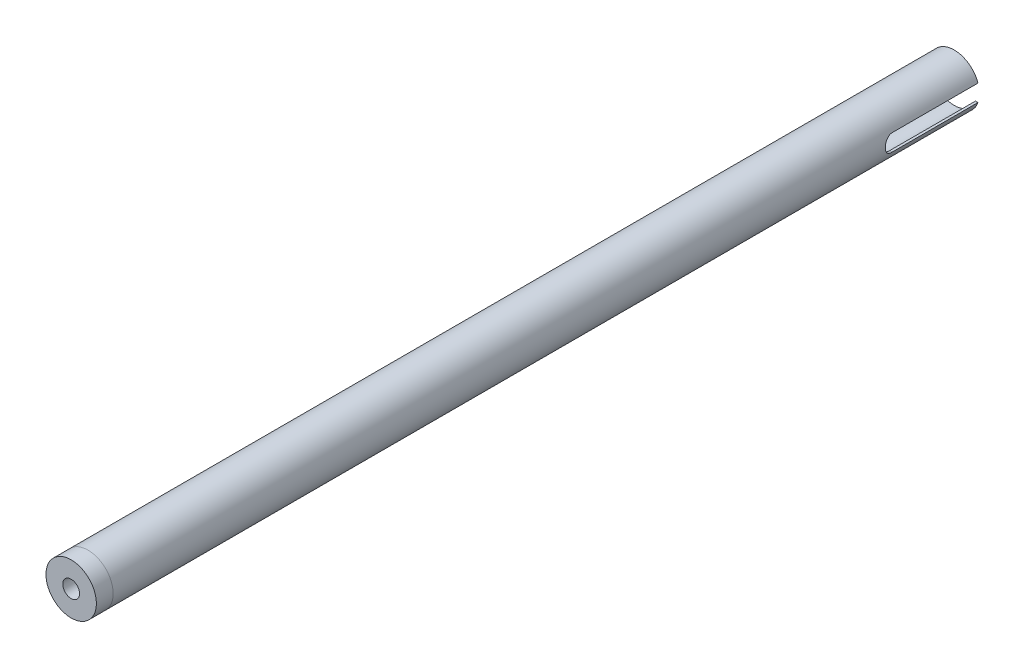
ISO-10303-21;
HEADER;
FILE_DESCRIPTION(('STEP AP214'),'2;1');
FILE_NAME('part.step','',(''),(''),'','','');
FILE_SCHEMA(('AUTOMOTIVE_DESIGN { 1 0 10303 214 1 1 1 1 }'));
ENDSEC;
DATA;
#1=APPLICATION_CONTEXT('core data for automotive mechanical design processes');
#2=APPLICATION_PROTOCOL_DEFINITION('international standard','automotive_design',2000,#1);
#3=PRODUCT_CONTEXT('',#1,'mechanical');
#4=PRODUCT('Part','Part','',(#3));
#5=PRODUCT_RELATED_PRODUCT_CATEGORY('part','',(#4));
#6=PRODUCT_DEFINITION_FORMATION('','',#4);
#7=PRODUCT_DEFINITION_CONTEXT('part definition',#1,'design');
#8=PRODUCT_DEFINITION('design','',#6,#7);
#9=PRODUCT_DEFINITION_SHAPE('','',#8);
#10=(LENGTH_UNIT() NAMED_UNIT(*) SI_UNIT(.MILLI.,.METRE.));
#11=(NAMED_UNIT(*) PLANE_ANGLE_UNIT() SI_UNIT($,.RADIAN.));
#12=(NAMED_UNIT(*) SI_UNIT($,.STERADIAN.) SOLID_ANGLE_UNIT());
#13=UNCERTAINTY_MEASURE_WITH_UNIT(LENGTH_MEASURE(1.E-05),#10,'distance_accuracy_value','');
#14=(GEOMETRIC_REPRESENTATION_CONTEXT(3) GLOBAL_UNCERTAINTY_ASSIGNED_CONTEXT((#13)) GLOBAL_UNIT_ASSIGNED_CONTEXT((#10,
#11,#12)) REPRESENTATION_CONTEXT('',''));
#15=CARTESIAN_POINT('',(0.,0.,0.));
#16=DIRECTION('',(0.,0.,1.));
#17=DIRECTION('',(1.,0.,0.));
#18=AXIS2_PLACEMENT_3D('',#15,#16,#17);
#19=CARTESIAN_POINT('',(0.,0.,-333.573444203244));
#20=DIRECTION('',(0.,0.,1.));
#21=DIRECTION('',(1.,0.,0.));
#22=AXIS2_PLACEMENT_3D('',#19,#20,#21);
#23=CYLINDRICAL_SURFACE('',#22,9.525);
#24=CARTESIAN_POINT('',(0.,0.,-6.35));
#25=DIRECTION('',(0.,0.,1.));
#26=DIRECTION('',(1.,0.,0.));
#27=AXIS2_PLACEMENT_3D('',#24,#25,#26);
#28=CIRCLE('',#27,9.525);
#29=CARTESIAN_POINT('',(9.525,0.,-6.35));
#30=VERTEX_POINT('',#29);
#31=EDGE_CURVE('E167',#30,#30,#28,.T.);
#32=ORIENTED_EDGE('',*,*,#31,.F.);
#33=EDGE_LOOP('',(#32));
#34=FACE_BOUND('',#33,.T.);
#35=CARTESIAN_POINT('',(-8.98025612106915,3.175,-301.188444203244));
#36=CARTESIAN_POINT('',(-8.98024230233901,3.17501142134308,-301.101818099908));
#37=CARTESIAN_POINT('',(-8.98150922759707,3.17145501317748,-301.015199717432));
#38=CARTESIAN_POINT('',(-8.98650170400112,3.1572955094353,-300.842634902606));
#39=CARTESIAN_POINT('',(-8.99022659113085,3.14669431699564,-300.75668829512));
#40=CARTESIAN_POINT('',(-9.00001740508998,3.11857670914845,-300.586334053955));
#41=CARTESIAN_POINT('',(-9.00607621805003,3.10108130380328,-300.501922552148));
#42=CARTESIAN_POINT('',(-9.02033586435303,3.05935434973544,-300.334987750813));
#43=CARTESIAN_POINT('',(-9.02853677497232,3.03512255799513,-300.252464519521));
#44=CARTESIAN_POINT('',(-9.05598792154067,2.95264369348964,-300.008665896245));
#45=CARTESIAN_POINT('',(-9.07810200713862,2.88457148458964,-299.85091231192));
#46=CARTESIAN_POINT('',(-9.127451360236,2.72437908867648,-299.549035793431));
#47=CARTESIAN_POINT('',(-9.15468995097455,2.63224328129309,-299.404921796203));
#48=CARTESIAN_POINT('',(-9.21240416673121,2.42269155952415,-299.128768936378));
#49=CARTESIAN_POINT('',(-9.24296008478943,2.30449853156514,-298.997335354516));
#50=CARTESIAN_POINT('',(-9.30318902123142,2.04784031127147,-298.75574005818));
#51=CARTESIAN_POINT('',(-9.33286185998227,1.90937102786997,-298.645582646947));
#52=CARTESIAN_POINT('',(-9.38892492365177,1.61159672697581,-298.446865635459));
#53=CARTESIAN_POINT('',(-9.41520772598946,1.45183792838573,-298.358953449449));
#54=CARTESIAN_POINT('',(-9.46054712430068,1.11883883316166,-298.211548723379));
#55=CARTESIAN_POINT('',(-9.47961052807859,0.945611424033788,-298.152029395378));
#56=CARTESIAN_POINT('',(-9.50410661247238,0.642992499572375,-298.076550630882));
#57=CARTESIAN_POINT('',(-9.51189798251809,0.515662964136016,-298.052932658839));
#58=CARTESIAN_POINT('',(-9.51973491912187,0.323120458247701,-298.029266392665));
#59=CARTESIAN_POINT('',(-9.52170555244691,0.258670486244991,-298.023337745049));
#60=CARTESIAN_POINT('',(-9.52433958502699,0.12948493034666,-298.015425120382));
#61=CARTESIAN_POINT('',(-9.5250026318504,0.0647492741617728,-298.013442206818));
#62=CARTESIAN_POINT('',(-9.525,0.,-298.013444203244));
#63=B_SPLINE_CURVE_WITH_KNOTS('',3,(#35,#36,#37,#38,#39,#40,#41,#42,#43,#44,#45,#46,#47,#48,#49,
#50,#51,#52,#53,#54,#55,#56,#57,#58,#59,#60,#61,#62),.UNSPECIFIED.,.F.,.F.,(4,2,2,2,2,2,2,2,2,2,
2,2,2,4),(0.,0.259783027985017,0.519495904525443,0.77842335407941,1.0373601457496,
1.55448370709133,2.07194378605916,2.60765740005743,3.14347925237348,3.69345572792671,
4.24291228331228,4.63105001394513,4.82518498412947,5.01937227204625),.UNSPECIFIED.);
#64=CARTESIAN_POINT('',(-8.98025612106915,3.175,-301.188444203244));
#65=VERTEX_POINT('',#64);
#66=CARTESIAN_POINT('',(-9.525,0.,-298.013444203244));
#67=VERTEX_POINT('',#66);
#68=EDGE_CURVE('E194',#65,#67,#63,.T.);
#69=ORIENTED_EDGE('',*,*,#68,.T.);
#70=CARTESIAN_POINT('',(-9.525,0.,-298.013444203244));
#71=CARTESIAN_POINT('',(-9.52501110102584,-0.0867614879611047,-298.013433098206));
#72=CARTESIAN_POINT('',(-9.52381482114642,-0.173516026970688,-298.017000309863));
#73=CARTESIAN_POINT('',(-9.51909010104991,-0.346361025979108,-298.031205148445));
#74=CARTESIAN_POINT('',(-9.51556219632442,-0.432451633867625,-298.041841151922));
#75=CARTESIAN_POINT('',(-9.50626969526085,-0.603121388983429,-298.070058143436));
#76=CARTESIAN_POINT('',(-9.50051134567603,-0.687704073408636,-298.087619737605));
#77=CARTESIAN_POINT('',(-9.48692170416637,-0.854983898510564,-298.129511058243));
#78=CARTESIAN_POINT('',(-9.47909035815865,-0.937680989932468,-298.153840961292));
#79=CARTESIAN_POINT('',(-9.45278540829331,-1.18202731628102,-298.236675354231));
#80=CARTESIAN_POINT('',(-9.43148823554423,-1.3401498669332,-298.305061035576));
#81=CARTESIAN_POINT('',(-9.38354405256208,-1.64264414222568,-298.465987561352));
#82=CARTESIAN_POINT('',(-9.35689419571071,-1.78700848960572,-298.558541266506));
#83=CARTESIAN_POINT('',(-9.30002401422067,-2.06291632995428,-298.768534694711));
#84=CARTESIAN_POINT('',(-9.26971861159363,-2.19392359690275,-298.88665698013));
#85=CARTESIAN_POINT('',(-9.20941732427212,-2.43468689521899,-299.142994956965));
#86=CARTESIAN_POINT('',(-9.1794215361322,-2.54443647619593,-299.281216725124));
#87=CARTESIAN_POINT('',(-9.122187697517,-2.74268087840455,-299.578724704171));
#88=CARTESIAN_POINT('',(-9.09505529775998,-2.83046425019681,-299.738506842244));
#89=CARTESIAN_POINT('',(-9.04794936227173,-2.9776233718293,-300.071551164249));
#90=CARTESIAN_POINT('',(-9.0279682579705,-3.03702917747985,-300.244798859057));
#91=CARTESIAN_POINT('',(-9.00226999890487,-3.1122125650425,-300.547085893052));
#92=CARTESIAN_POINT('',(-8.99408207355733,-3.13569679171672,-300.674048214479));
#93=CARTESIAN_POINT('',(-8.98304472933549,-3.16711304593222,-300.930125386248));
#94=CARTESIAN_POINT('',(-8.98019613476149,-3.17504267212105,-301.05924056585));
#95=CARTESIAN_POINT('',(-8.98025612106915,-3.175,-301.188444203244));
#96=B_SPLINE_CURVE_WITH_KNOTS('',3,(#70,#71,#72,#73,#74,#75,#76,#77,#78,#79,#80,#81,#82,#83,#84,
#85,#86,#87,#88,#89,#90,#91,#92,#93,#94,#95),.UNSPECIFIED.,.F.,.F.,(4,2,2,2,2,2,2,2,2,2,2,2,4),
(0.,0.260191091827307,0.52032244773723,0.779730467212497,1.03914525511038,1.55731822615721,
2.07576750062865,2.61028978360824,3.14497400776474,3.6952175213376,4.24487695078963,
4.63199348452988,5.01916977744542),.UNSPECIFIED.);
#97=CARTESIAN_POINT('',(-8.98025612106916,-3.175,-301.188444203244));
#98=VERTEX_POINT('',#97);
#99=EDGE_CURVE('E146',#67,#98,#96,.T.);
#100=ORIENTED_EDGE('',*,*,#99,.T.);
#101=DIRECTION('',(0.,0.,-1.));
#102=VECTOR('',#101,1.);
#103=CARTESIAN_POINT('',(-8.98025612106916,-3.175,-298.013444203244));
#104=LINE('',#103,#102);
#105=CARTESIAN_POINT('',(-8.98025612106916,-3.175,-333.573444203244));
#106=VERTEX_POINT('',#105);
#107=EDGE_CURVE('E141',#98,#106,#104,.T.);
#108=ORIENTED_EDGE('',*,*,#107,.T.);
#109=CARTESIAN_POINT('',(0.,0.,-333.573444203244));
#110=DIRECTION('',(0.,0.,1.));
#111=DIRECTION('',(1.,0.,0.));
#112=AXIS2_PLACEMENT_3D('',#109,#110,#111);
#113=CIRCLE('',#112,9.525);
#114=CARTESIAN_POINT('',(8.98025612106915,-3.175,-333.573444203244));
#115=VERTEX_POINT('',#114);
#116=EDGE_CURVE('E144',#106,#115,#113,.T.);
#117=ORIENTED_EDGE('',*,*,#116,.T.);
#118=DIRECTION('',(0.,0.,-1.));
#119=VECTOR('',#118,1.);
#120=CARTESIAN_POINT('',(8.98025612106915,-3.175,-298.013444203244));
#121=LINE('',#120,#119);
#122=CARTESIAN_POINT('',(8.98025612106915,-3.175,-301.188444203244));
#123=VERTEX_POINT('',#122);
#124=EDGE_CURVE('E427',#123,#115,#121,.T.);
#125=ORIENTED_EDGE('',*,*,#124,.F.);
#126=CARTESIAN_POINT('',(8.98025612106915,-3.175,-301.188444203244));
#127=CARTESIAN_POINT('',(8.98024230233901,-3.17501142134308,-301.101818099908));
#128=CARTESIAN_POINT('',(8.98150922759707,-3.17145501317748,-301.015199717432));
#129=CARTESIAN_POINT('',(8.98650170400112,-3.1572955094353,-300.842634902606));
#130=CARTESIAN_POINT('',(8.99022659113085,-3.14669431699564,-300.75668829512));
#131=CARTESIAN_POINT('',(9.00001740508998,-3.11857670914845,-300.586334053955));
#132=CARTESIAN_POINT('',(9.00607621805003,-3.10108130380328,-300.501922552148));
#133=CARTESIAN_POINT('',(9.02033586435303,-3.05935434973544,-300.334987750813));
#134=CARTESIAN_POINT('',(9.02853677497232,-3.03512255799513,-300.252464519521));
#135=CARTESIAN_POINT('',(9.05598792154067,-2.95264369348964,-300.008665896245));
#136=CARTESIAN_POINT('',(9.07810200713862,-2.88457148458964,-299.85091231192));
#137=CARTESIAN_POINT('',(9.127451360236,-2.72437908867648,-299.549035793431));
#138=CARTESIAN_POINT('',(9.15468995097455,-2.63224328129309,-299.404921796203));
#139=CARTESIAN_POINT('',(9.21240416673121,-2.42269155952415,-299.128768936378));
#140=CARTESIAN_POINT('',(9.24296008478943,-2.30449853156514,-298.997335354516));
#141=CARTESIAN_POINT('',(9.30318902123142,-2.04784031127147,-298.75574005818));
#142=CARTESIAN_POINT('',(9.33286185998227,-1.90937102786997,-298.645582646947));
#143=CARTESIAN_POINT('',(9.38892492365177,-1.61159672697581,-298.446865635459));
#144=CARTESIAN_POINT('',(9.41520772598946,-1.45183792838573,-298.358953449449));
#145=CARTESIAN_POINT('',(9.46054712430068,-1.11883883316166,-298.211548723379));
#146=CARTESIAN_POINT('',(9.47961052807859,-0.945611424033788,-298.152029395378));
#147=CARTESIAN_POINT('',(9.50410661247238,-0.642992499572375,-298.076550630882));
#148=CARTESIAN_POINT('',(9.51189798251809,-0.515662964136016,-298.052932658839));
#149=CARTESIAN_POINT('',(9.51973491912187,-0.323120458247701,-298.029266392665));
#150=CARTESIAN_POINT('',(9.52170555244691,-0.258670486244991,-298.023337745049));
#151=CARTESIAN_POINT('',(9.52433958502699,-0.12948493034666,-298.015425120382));
#152=CARTESIAN_POINT('',(9.5250026318504,-0.0647492741617728,-298.013442206818));
#153=CARTESIAN_POINT('',(9.525,0.,-298.013444203244));
#154=B_SPLINE_CURVE_WITH_KNOTS('',3,(#126,#127,#128,#129,#130,#131,#132,#133,#134,#135,#136,
#137,#138,#139,#140,#141,#142,#143,#144,#145,#146,#147,#148,#149,#150,#151,#152,#153),
.UNSPECIFIED.,.F.,.F.,(4,2,2,2,2,2,2,2,2,2,2,2,2,4),(0.,0.259783027985017,0.519495904525443,
0.77842335407941,1.0373601457496,1.55448370709133,2.07194378605916,2.60765740005743,
3.14347925237348,3.69345572792671,4.24291228331228,4.63105001394513,4.82518498412947,
5.01937227204625),.UNSPECIFIED.);
#155=CARTESIAN_POINT('',(9.525,0.,-298.013444203244));
#156=VERTEX_POINT('',#155);
#157=EDGE_CURVE('E87',#123,#156,#154,.T.);
#158=ORIENTED_EDGE('',*,*,#157,.T.);
#159=CARTESIAN_POINT('',(9.525,0.,-298.013444203244));
#160=CARTESIAN_POINT('',(9.52501110102584,0.0867614879611047,-298.013433098206));
#161=CARTESIAN_POINT('',(9.52381482114642,0.173516026970688,-298.017000309863));
#162=CARTESIAN_POINT('',(9.51909010104991,0.346361025979108,-298.031205148445));
#163=CARTESIAN_POINT('',(9.51556219632442,0.432451633867625,-298.041841151922));
#164=CARTESIAN_POINT('',(9.50626969526085,0.603121388983429,-298.070058143436));
#165=CARTESIAN_POINT('',(9.50051134567603,0.687704073408636,-298.087619737605));
#166=CARTESIAN_POINT('',(9.48692170416637,0.854983898510564,-298.129511058243));
#167=CARTESIAN_POINT('',(9.47909035815865,0.937680989932468,-298.153840961292));
#168=CARTESIAN_POINT('',(9.45278540829331,1.18202731628102,-298.236675354231));
#169=CARTESIAN_POINT('',(9.43148823554423,1.3401498669332,-298.305061035576));
#170=CARTESIAN_POINT('',(9.38354405256208,1.64264414222568,-298.465987561352));
#171=CARTESIAN_POINT('',(9.35689419571071,1.78700848960572,-298.558541266506));
#172=CARTESIAN_POINT('',(9.30002401422067,2.06291632995428,-298.768534694711));
#173=CARTESIAN_POINT('',(9.26971861159363,2.19392359690275,-298.88665698013));
#174=CARTESIAN_POINT('',(9.20941732427212,2.43468689521899,-299.142994956965));
#175=CARTESIAN_POINT('',(9.1794215361322,2.54443647619593,-299.281216725124));
#176=CARTESIAN_POINT('',(9.122187697517,2.74268087840455,-299.578724704171));
#177=CARTESIAN_POINT('',(9.09505529775998,2.83046425019681,-299.738506842244));
#178=CARTESIAN_POINT('',(9.04794936227173,2.9776233718293,-300.071551164249));
#179=CARTESIAN_POINT('',(9.0279682579705,3.03702917747985,-300.244798859057));
#180=CARTESIAN_POINT('',(9.00226999890487,3.1122125650425,-300.547085893052));
#181=CARTESIAN_POINT('',(8.99408207355733,3.13569679171672,-300.674048214479));
#182=CARTESIAN_POINT('',(8.98304472933549,3.16711304593222,-300.930125386248));
#183=CARTESIAN_POINT('',(8.98019613476149,3.17504267212105,-301.05924056585));
#184=CARTESIAN_POINT('',(8.98025612106915,3.175,-301.188444203244));
#185=B_SPLINE_CURVE_WITH_KNOTS('',3,(#159,#160,#161,#162,#163,#164,#165,#166,#167,#168,#169,
#170,#171,#172,#173,#174,#175,#176,#177,#178,#179,#180,#181,#182,#183,#184),.UNSPECIFIED.,.F.,
.F.,(4,2,2,2,2,2,2,2,2,2,2,2,4),(0.,0.260191091827307,0.52032244773723,0.779730467212497,
1.03914525511038,1.55731822615721,2.07576750062865,2.61028978360824,3.14497400776474,
3.6952175213376,4.24487695078963,4.63199348452988,5.01916977744542),.UNSPECIFIED.);
#186=CARTESIAN_POINT('',(8.98025612106915,3.175,-301.188444203244));
#187=VERTEX_POINT('',#186);
#188=EDGE_CURVE('E73',#156,#187,#185,.T.);
#189=ORIENTED_EDGE('',*,*,#188,.T.);
#190=DIRECTION('',(0.,0.,-1.));
#191=VECTOR('',#190,1.);
#192=CARTESIAN_POINT('',(8.98025612106915,3.175,-298.013444203244));
#193=LINE('',#192,#191);
#194=CARTESIAN_POINT('',(8.98025612106915,3.175,-333.573444203244));
#195=VERTEX_POINT('',#194);
#196=EDGE_CURVE('E160',#187,#195,#193,.T.);
#197=ORIENTED_EDGE('',*,*,#196,.T.);
#198=CARTESIAN_POINT('',(-8.98025612106915,3.175,-333.573444203244));
#199=VERTEX_POINT('',#198);
#200=EDGE_CURVE('E166',#195,#199,#113,.T.);
#201=ORIENTED_EDGE('',*,*,#200,.T.);
#202=DIRECTION('',(0.,0.,-1.));
#203=VECTOR('',#202,1.);
#204=CARTESIAN_POINT('',(-8.98025612106915,3.175,-298.013444203244));
#205=LINE('',#204,#203);
#206=EDGE_CURVE('E420',#65,#199,#205,.T.);
#207=ORIENTED_EDGE('',*,*,#206,.F.);
#208=EDGE_LOOP('',(#69,#100,#108,#117,#125,#158,#189,#197,#201,#207));
#209=FACE_BOUND('',#208,.T.);
#210=ADVANCED_FACE('F63',(#34,#209),#23,.T.);
#211=CARTESIAN_POINT('',(0.,0.,-333.573444203244));
#212=DIRECTION('',(0.,0.,1.));
#213=DIRECTION('',(1.,0.,0.));
#214=AXIS2_PLACEMENT_3D('',#211,#212,#213);
#215=PLANE('',#214);
#216=DIRECTION('',(1.,0.,0.));
#217=VECTOR('',#216,1.);
#218=CARTESIAN_POINT('',(0.,-3.175,-333.573444203244));
#219=LINE('',#218,#217);
#220=CARTESIAN_POINT('',(-8.03118117091129,-3.175,-333.573444203244));
#221=VERTEX_POINT('',#220);
#222=EDGE_CURVE('E153',#106,#221,#219,.T.);
#223=ORIENTED_EDGE('',*,*,#222,.T.);
#224=CARTESIAN_POINT('',(0.,0.,-333.573444203244));
#225=DIRECTION('',(0.,0.,1.));
#226=DIRECTION('',(1.,0.,0.));
#227=AXIS2_PLACEMENT_3D('',#224,#225,#226);
#228=CIRCLE('',#227,8.636);
#229=CARTESIAN_POINT('',(8.03118117091129,-3.175,-333.573444203244));
#230=VERTEX_POINT('',#229);
#231=EDGE_CURVE('E275',#221,#230,#228,.T.);
#232=ORIENTED_EDGE('',*,*,#231,.T.);
#233=DIRECTION('',(1.,0.,0.));
#234=VECTOR('',#233,1.);
#235=CARTESIAN_POINT('',(0.,-3.175,-333.573444203244));
#236=LINE('',#235,#234);
#237=EDGE_CURVE('E165',#230,#115,#236,.T.);
#238=ORIENTED_EDGE('',*,*,#237,.T.);
#239=ORIENTED_EDGE('',*,*,#116,.F.);
#240=EDGE_LOOP('',(#223,#232,#238,#239));
#241=FACE_BOUND('',#240,.T.);
#242=ADVANCED_FACE('F163',(#241),#215,.F.);
#243=CARTESIAN_POINT('',(0.,0.,-333.573444203244));
#244=DIRECTION('',(0.,0.,1.));
#245=DIRECTION('',(1.,0.,0.));
#246=AXIS2_PLACEMENT_3D('',#243,#244,#245);
#247=CYLINDRICAL_SURFACE('',#246,8.636);
#248=CARTESIAN_POINT('',(0.,0.,-6.35));
#249=DIRECTION('',(0.,0.,1.));
#250=DIRECTION('',(1.,0.,0.));
#251=AXIS2_PLACEMENT_3D('',#248,#249,#250);
#252=CIRCLE('',#251,8.636);
#253=CARTESIAN_POINT('',(8.636,0.,-6.35));
#254=VERTEX_POINT('',#253);
#255=EDGE_CURVE('E149',#254,#254,#252,.T.);
#256=ORIENTED_EDGE('',*,*,#255,.T.);
#257=EDGE_LOOP('',(#256));
#258=FACE_BOUND('',#257,.T.);
#259=DIRECTION('',(0.,0.,-1.));
#260=VECTOR('',#259,1.);
#261=CARTESIAN_POINT('',(-8.03118117091129,-3.175,-298.013444203244));
#262=LINE('',#261,#260);
#263=CARTESIAN_POINT('',(-8.03118117091129,-3.175,-301.188444203244));
#264=VERTEX_POINT('',#263);
#265=EDGE_CURVE('E150',#264,#221,#262,.T.);
#266=ORIENTED_EDGE('',*,*,#265,.F.);
#267=CARTESIAN_POINT('',(-8.03118117091129,-3.175,-301.188444203244));
#268=CARTESIAN_POINT('',(-8.03116550357192,-3.17501203663229,-301.102409235128));
#269=CARTESIAN_POINT('',(-8.03256328665432,-3.17150327993899,-301.016382882599));
#270=CARTESIAN_POINT('',(-8.03806891362409,-3.15753809299539,-300.845010312129));
#271=CARTESIAN_POINT('',(-8.04217588089716,-3.14708391007799,-300.759663883223));
#272=CARTESIAN_POINT('',(-8.05296421917626,-3.11937037021479,-300.590554749008));
#273=CARTESIAN_POINT('',(-8.05963650808001,-3.10213501593151,-300.506787538066));
#274=CARTESIAN_POINT('',(-8.07533202922414,-3.06104389654163,-300.341138575298));
#275=CARTESIAN_POINT('',(-8.08435537430867,-3.0371878136549,-300.259256914178));
#276=CARTESIAN_POINT('',(-8.11453837074661,-2.95603278100127,-300.017404756933));
#277=CARTESIAN_POINT('',(-8.13883087950844,-2.88909903597752,-299.860938119358));
#278=CARTESIAN_POINT('',(-8.19300406693486,-2.73167948818753,-299.561403130233));
#279=CARTESIAN_POINT('',(-8.22288931448619,-2.64117440539563,-299.418345877676));
#280=CARTESIAN_POINT('',(-8.28646461334555,-2.43457537576576,-299.142875468438));
#281=CARTESIAN_POINT('',(-8.32026315150129,-2.317546455696,-299.011187096351));
#282=CARTESIAN_POINT('',(-8.38695072719909,-2.06320558041454,-298.768798917958));
#283=CARTESIAN_POINT('',(-8.41983956911545,-1.9258893021522,-298.658103596588));
#284=CARTESIAN_POINT('',(-8.48230406273647,-1.62932475427477,-298.457322481637));
#285=CARTESIAN_POINT('',(-8.5117351959247,-1.46950375402868,-298.368034128132));
#286=CARTESIAN_POINT('',(-8.56262575627031,-1.13591027783605,-298.217971975168));
#287=CARTESIAN_POINT('',(-8.58409342507971,-0.962152453429211,-298.157168678348));
#288=CARTESIAN_POINT('',(-8.61197450421744,-0.656412542712579,-298.079244312699));
#289=CARTESIAN_POINT('',(-8.62092967235125,-0.526538210349253,-298.05462852836));
#290=CARTESIAN_POINT('',(-8.62994176115801,-0.33002097693851,-298.029951196644));
#291=CARTESIAN_POINT('',(-8.63220903333296,-0.264206342476355,-298.023766457494));
#292=CARTESIAN_POINT('',(-8.63523992352765,-0.132266265743979,-298.015511242048));
#293=CARTESIAN_POINT('',(-8.6360031097792,-0.0661407396870706,-298.013441947146));
#294=CARTESIAN_POINT('',(-8.636,0.,-298.013444203244));
#295=B_SPLINE_CURVE_WITH_KNOTS('',3,(#267,#268,#269,#270,#271,#272,#273,#274,#275,#276,#277,
#278,#279,#280,#281,#282,#283,#284,#285,#286,#287,#288,#289,#290,#291,#292,#293,#294),
.UNSPECIFIED.,.F.,.F.,(4,2,2,2,2,2,2,2,2,2,2,2,2,4),(0.,0.258007583993629,0.515931725057005,
0.772951013405637,1.02998264023838,1.54317615093285,2.05679075055082,2.59254838663378,
3.128420352877,3.6819142239817,4.23483365719865,4.63113823379683,4.82943692106888,
5.02779252437178),.UNSPECIFIED.);
#296=CARTESIAN_POINT('',(-8.636,0.,-298.013444203244));
#297=VERTEX_POINT('',#296);
#298=EDGE_CURVE('E221',#264,#297,#295,.T.);
#299=ORIENTED_EDGE('',*,*,#298,.T.);
#300=CARTESIAN_POINT('',(-8.636,0.,-298.013444203244));
#301=CARTESIAN_POINT('',(-8.63601200177566,0.0862340545028663,-298.01343262952));
#302=CARTESIAN_POINT('',(-8.63470866649585,0.172460638964016,-298.01695716954));
#303=CARTESIAN_POINT('',(-8.62956076290727,0.344245368623961,-298.03098859917));
#304=CARTESIAN_POINT('',(-8.62571686385256,0.429803683858972,-298.041493649926));
#305=CARTESIAN_POINT('',(-8.61559314175803,0.599377201936824,-298.069352403981));
#306=CARTESIAN_POINT('',(-8.60932102288695,0.683396413719317,-298.086684449838));
#307=CARTESIAN_POINT('',(-8.5945171663722,0.849553539449469,-298.128015673113));
#308=CARTESIAN_POINT('',(-8.58598535382315,0.93169139093483,-298.152015071546));
#309=CARTESIAN_POINT('',(-8.55732464851214,1.17435074221828,-298.233689252984));
#310=CARTESIAN_POINT('',(-8.53411500636261,1.33136171263578,-298.30108057395));
#311=CARTESIAN_POINT('',(-8.48180653117632,1.63181198358795,-298.45957228396));
#312=CARTESIAN_POINT('',(-8.45270389942466,1.77524244193608,-298.550687976997));
#313=CARTESIAN_POINT('',(-8.39029834803106,2.05036661398533,-298.757941094676));
#314=CARTESIAN_POINT('',(-8.35688032192871,2.18143474113563,-298.874875462268));
#315=CARTESIAN_POINT('',(-8.29018507770489,2.42260670191498,-299.128764448724));
#316=CARTESIAN_POINT('',(-8.25690791509208,2.5327029092675,-299.265726318554));
#317=CARTESIAN_POINT('',(-8.19291826363247,2.73277128594141,-299.561891407379));
#318=CARTESIAN_POINT('',(-8.16234475412034,2.82185641770732,-299.721726496816));
#319=CARTESIAN_POINT('',(-8.10906121054024,2.97153048258984,-300.055321840318));
#320=CARTESIAN_POINT('',(-8.08634169503735,3.03215380703845,-300.229064989987));
#321=CARTESIAN_POINT('',(-8.05677760160867,3.10966172606007,-300.5343336248));
#322=CARTESIAN_POINT('',(-8.04725077861386,3.13409804308655,-300.663714344006));
#323=CARTESIAN_POINT('',(-8.03764862425496,3.15860280233702,-300.859521469847));
#324=CARTESIAN_POINT('',(-8.0352292163598,3.16474613160121,-300.925114226152));
#325=CARTESIAN_POINT('',(-8.03199317651195,3.17294655384153,-301.056614178542));
#326=CARTESIAN_POINT('',(-8.03117703985816,3.17500238406813,-301.122521465493));
#327=CARTESIAN_POINT('',(-8.03118117091129,3.175,-301.188444203244));
#328=B_SPLINE_CURVE_WITH_KNOTS('',3,(#300,#301,#302,#303,#304,#305,#306,#307,#308,#309,#310,
#311,#312,#313,#314,#315,#316,#317,#318,#319,#320,#321,#322,#323,#324,#325,#326,#327),
.UNSPECIFIED.,.F.,.F.,(4,2,2,2,2,2,2,2,2,2,2,2,2,4),(0.,0.25860768427724,0.517147271349144,
0.774873208333403,1.03260768960759,1.54734347080468,2.06241212125685,2.59642224394467,
3.13062618611954,3.6844391606936,4.23758121159796,4.63245186558862,4.83009172977028,
5.0277926412787),.UNSPECIFIED.);
#329=CARTESIAN_POINT('',(-8.03118117091129,3.175,-301.188444203244));
#330=VERTEX_POINT('',#329);
#331=EDGE_CURVE('E186',#297,#330,#328,.T.);
#332=ORIENTED_EDGE('',*,*,#331,.T.);
#333=DIRECTION('',(0.,0.,-1.));
#334=VECTOR('',#333,1.);
#335=CARTESIAN_POINT('',(-8.03118117091129,3.175,-298.013444203244));
#336=LINE('',#335,#334);
#337=CARTESIAN_POINT('',(-8.03118117091129,3.175,-333.573444203244));
#338=VERTEX_POINT('',#337);
#339=EDGE_CURVE('E417',#330,#338,#336,.T.);
#340=ORIENTED_EDGE('',*,*,#339,.T.);
#341=CARTESIAN_POINT('',(8.03118117091129,3.175,-333.573444203244));
#342=VERTEX_POINT('',#341);
#343=EDGE_CURVE('E172',#342,#338,#228,.T.);
#344=ORIENTED_EDGE('',*,*,#343,.F.);
#345=DIRECTION('',(0.,0.,-1.));
#346=VECTOR('',#345,1.);
#347=CARTESIAN_POINT('',(8.03118117091129,3.175,-298.013444203244));
#348=LINE('',#347,#346);
#349=CARTESIAN_POINT('',(8.03118117091129,3.175,-301.188444203244));
#350=VERTEX_POINT('',#349);
#351=EDGE_CURVE('E269',#350,#342,#348,.T.);
#352=ORIENTED_EDGE('',*,*,#351,.F.);
#353=CARTESIAN_POINT('',(8.03118117091129,3.175,-301.188444203244));
#354=CARTESIAN_POINT('',(8.03116550357192,3.17501203663229,-301.102409235128));
#355=CARTESIAN_POINT('',(8.03256328665432,3.17150327993899,-301.016382882599));
#356=CARTESIAN_POINT('',(8.03806891362409,3.15753809299539,-300.845010312129));
#357=CARTESIAN_POINT('',(8.04217588089716,3.14708391007799,-300.759663883223));
#358=CARTESIAN_POINT('',(8.05296421917626,3.11937037021479,-300.590554749008));
#359=CARTESIAN_POINT('',(8.05963650808001,3.10213501593151,-300.506787538066));
#360=CARTESIAN_POINT('',(8.07533202922414,3.06104389654163,-300.341138575298));
#361=CARTESIAN_POINT('',(8.08435537430867,3.0371878136549,-300.259256914178));
#362=CARTESIAN_POINT('',(8.11453837074661,2.95603278100127,-300.017404756933));
#363=CARTESIAN_POINT('',(8.13883087950844,2.88909903597752,-299.860938119358));
#364=CARTESIAN_POINT('',(8.19300406693486,2.73167948818753,-299.561403130233));
#365=CARTESIAN_POINT('',(8.22288931448619,2.64117440539563,-299.418345877676));
#366=CARTESIAN_POINT('',(8.28646461334555,2.43457537576576,-299.142875468438));
#367=CARTESIAN_POINT('',(8.32026315150129,2.317546455696,-299.011187096351));
#368=CARTESIAN_POINT('',(8.38695072719909,2.06320558041454,-298.768798917958));
#369=CARTESIAN_POINT('',(8.41983956911545,1.9258893021522,-298.658103596588));
#370=CARTESIAN_POINT('',(8.48230406273647,1.62932475427477,-298.457322481637));
#371=CARTESIAN_POINT('',(8.5117351959247,1.46950375402868,-298.368034128132));
#372=CARTESIAN_POINT('',(8.56262575627031,1.13591027783605,-298.217971975168));
#373=CARTESIAN_POINT('',(8.58409342507971,0.962152453429211,-298.157168678348));
#374=CARTESIAN_POINT('',(8.61197450421744,0.656412542712579,-298.079244312699));
#375=CARTESIAN_POINT('',(8.62092967235125,0.526538210349253,-298.05462852836));
#376=CARTESIAN_POINT('',(8.62994176115801,0.33002097693851,-298.029951196644));
#377=CARTESIAN_POINT('',(8.63220903333296,0.264206342476355,-298.023766457494));
#378=CARTESIAN_POINT('',(8.63523992352765,0.132266265743979,-298.015511242048));
#379=CARTESIAN_POINT('',(8.6360031097792,0.0661407396870706,-298.013441947146));
#380=CARTESIAN_POINT('',(8.636,0.,-298.013444203244));
#381=B_SPLINE_CURVE_WITH_KNOTS('',3,(#353,#354,#355,#356,#357,#358,#359,#360,#361,#362,#363,
#364,#365,#366,#367,#368,#369,#370,#371,#372,#373,#374,#375,#376,#377,#378,#379,#380),
.UNSPECIFIED.,.F.,.F.,(4,2,2,2,2,2,2,2,2,2,2,2,2,4),(0.,0.258007583993629,0.515931725057005,
0.772951013405637,1.02998264023838,1.54317615093285,2.05679075055082,2.59254838663378,
3.128420352877,3.6819142239817,4.23483365719865,4.63113823379683,4.82943692106888,
5.02779252437178),.UNSPECIFIED.);
#382=CARTESIAN_POINT('',(8.636,0.,-298.013444203244));
#383=VERTEX_POINT('',#382);
#384=EDGE_CURVE('E13',#350,#383,#381,.T.);
#385=ORIENTED_EDGE('',*,*,#384,.T.);
#386=CARTESIAN_POINT('',(8.636,0.,-298.013444203244));
#387=CARTESIAN_POINT('',(8.63601200177566,-0.0862340545028663,-298.01343262952));
#388=CARTESIAN_POINT('',(8.63470866649585,-0.172460638964016,-298.01695716954));
#389=CARTESIAN_POINT('',(8.62956076290727,-0.344245368623961,-298.03098859917));
#390=CARTESIAN_POINT('',(8.62571686385256,-0.429803683858972,-298.041493649926));
#391=CARTESIAN_POINT('',(8.61559314175803,-0.599377201936824,-298.069352403981));
#392=CARTESIAN_POINT('',(8.60932102288695,-0.683396413719317,-298.086684449838));
#393=CARTESIAN_POINT('',(8.5945171663722,-0.849553539449469,-298.128015673113));
#394=CARTESIAN_POINT('',(8.58598535382315,-0.93169139093483,-298.152015071546));
#395=CARTESIAN_POINT('',(8.55732464851214,-1.17435074221828,-298.233689252984));
#396=CARTESIAN_POINT('',(8.53411500636261,-1.33136171263578,-298.30108057395));
#397=CARTESIAN_POINT('',(8.48180653117632,-1.63181198358795,-298.45957228396));
#398=CARTESIAN_POINT('',(8.45270389942466,-1.77524244193608,-298.550687976997));
#399=CARTESIAN_POINT('',(8.39029834803106,-2.05036661398533,-298.757941094676));
#400=CARTESIAN_POINT('',(8.35688032192871,-2.18143474113563,-298.874875462268));
#401=CARTESIAN_POINT('',(8.29018507770489,-2.42260670191498,-299.128764448724));
#402=CARTESIAN_POINT('',(8.25690791509208,-2.5327029092675,-299.265726318554));
#403=CARTESIAN_POINT('',(8.19291826363247,-2.73277128594141,-299.561891407379));
#404=CARTESIAN_POINT('',(8.16234475412034,-2.82185641770732,-299.721726496816));
#405=CARTESIAN_POINT('',(8.10906121054024,-2.97153048258984,-300.055321840318));
#406=CARTESIAN_POINT('',(8.08634169503735,-3.03215380703845,-300.229064989987));
#407=CARTESIAN_POINT('',(8.05677760160867,-3.10966172606007,-300.5343336248));
#408=CARTESIAN_POINT('',(8.04725077861386,-3.13409804308655,-300.663714344006));
#409=CARTESIAN_POINT('',(8.03764862425496,-3.15860280233702,-300.859521469847));
#410=CARTESIAN_POINT('',(8.0352292163598,-3.16474613160121,-300.925114226152));
#411=CARTESIAN_POINT('',(8.03199317651195,-3.17294655384153,-301.056614178542));
#412=CARTESIAN_POINT('',(8.03117703985816,-3.17500238406813,-301.122521465493));
#413=CARTESIAN_POINT('',(8.03118117091129,-3.175,-301.188444203244));
#414=B_SPLINE_CURVE_WITH_KNOTS('',3,(#386,#387,#388,#389,#390,#391,#392,#393,#394,#395,#396,
#397,#398,#399,#400,#401,#402,#403,#404,#405,#406,#407,#408,#409,#410,#411,#412,#413),
.UNSPECIFIED.,.F.,.F.,(4,2,2,2,2,2,2,2,2,2,2,2,2,4),(0.,0.25860768427724,0.517147271349144,
0.774873208333403,1.03260768960759,1.54734347080468,2.06241212125685,2.59642224394467,
3.13062618611954,3.6844391606936,4.23758121159796,4.63245186558862,4.83009172977028,
5.0277926412787),.UNSPECIFIED.);
#415=CARTESIAN_POINT('',(8.03118117091129,-3.175,-301.188444203244));
#416=VERTEX_POINT('',#415);
#417=EDGE_CURVE('E237',#383,#416,#414,.T.);
#418=ORIENTED_EDGE('',*,*,#417,.T.);
#419=DIRECTION('',(0.,0.,-1.));
#420=VECTOR('',#419,1.);
#421=CARTESIAN_POINT('',(8.03118117091129,-3.175,-298.013444203244));
#422=LINE('',#421,#420);
#423=EDGE_CURVE('E271',#416,#230,#422,.T.);
#424=ORIENTED_EDGE('',*,*,#423,.T.);
#425=ORIENTED_EDGE('',*,*,#231,.F.);
#426=EDGE_LOOP('',(#266,#299,#332,#340,#344,#352,#385,#418,#424,#425));
#427=FACE_BOUND('',#426,.T.);
#428=ADVANCED_FACE('F201',(#258,#427),#247,.F.);
#429=ORIENTED_EDGE('',*,*,#343,.T.);
#430=DIRECTION('',(1.,0.,0.));
#431=VECTOR('',#430,1.);
#432=CARTESIAN_POINT('',(0.,3.175,-333.573444203244));
#433=LINE('',#432,#431);
#434=EDGE_CURVE('E159',#199,#338,#433,.T.);
#435=ORIENTED_EDGE('',*,*,#434,.F.);
#436=ORIENTED_EDGE('',*,*,#200,.F.);
#437=DIRECTION('',(1.,0.,0.));
#438=VECTOR('',#437,1.);
#439=CARTESIAN_POINT('',(0.,3.175,-333.573444203244));
#440=LINE('',#439,#438);
#441=EDGE_CURVE('E253',#342,#195,#440,.T.);
#442=ORIENTED_EDGE('',*,*,#441,.F.);
#443=EDGE_LOOP('',(#429,#435,#436,#442));
#444=FACE_BOUND('',#443,.T.);
#445=ADVANCED_FACE('F286',(#444),#215,.F.);
#446=CARTESIAN_POINT('',(0.,0.,-6.35));
#447=DIRECTION('',(0.,0.,1.));
#448=DIRECTION('',(1.,0.,0.));
#449=AXIS2_PLACEMENT_3D('',#446,#447,#448);
#450=PLANE('',#449);
#451=ORIENTED_EDGE('',*,*,#255,.F.);
#452=EDGE_LOOP('',(#451));
#453=FACE_BOUND('',#452,.T.);
#454=ORIENTED_EDGE('',*,*,#31,.T.);
#455=EDGE_LOOP('',(#454));
#456=FACE_BOUND('',#455,.T.);
#457=ADVANCED_FACE('F283',(#453,#456),#450,.T.);
#458=CARTESIAN_POINT('',(0.,3.175,-298.013444203244));
#459=DIRECTION('',(0.,1.,0.));
#460=DIRECTION('',(0.,0.,1.));
#461=AXIS2_PLACEMENT_3D('',#458,#459,#460);
#462=PLANE('',#461);
#463=ORIENTED_EDGE('',*,*,#196,.F.);
#464=DIRECTION('',(1.,0.,0.));
#465=VECTOR('',#464,1.);
#466=CARTESIAN_POINT('',(8.03118117091129,3.175,-301.188444203244));
#467=LINE('',#466,#465);
#468=EDGE_CURVE('E184',#187,#350,#467,.F.);
#469=ORIENTED_EDGE('',*,*,#468,.T.);
#470=ORIENTED_EDGE('',*,*,#351,.T.);
#471=ORIENTED_EDGE('',*,*,#441,.T.);
#472=EDGE_LOOP('',(#463,#469,#470,#471));
#473=FACE_BOUND('',#472,.T.);
#474=ADVANCED_FACE('F266',(#473),#462,.F.);
#475=CARTESIAN_POINT('',(0.,-3.175,-298.013444203244));
#476=DIRECTION('',(0.,1.,0.));
#477=DIRECTION('',(0.,0.,1.));
#478=AXIS2_PLACEMENT_3D('',#475,#476,#477);
#479=PLANE('',#478);
#480=ORIENTED_EDGE('',*,*,#423,.F.);
#481=DIRECTION('',(1.,0.,0.));
#482=VECTOR('',#481,1.);
#483=CARTESIAN_POINT('',(0.,-3.175,-301.188444203244));
#484=LINE('',#483,#482);
#485=EDGE_CURVE('E181',#416,#123,#484,.T.);
#486=ORIENTED_EDGE('',*,*,#485,.T.);
#487=ORIENTED_EDGE('',*,*,#124,.T.);
#488=ORIENTED_EDGE('',*,*,#237,.F.);
#489=EDGE_LOOP('',(#480,#486,#487,#488));
#490=FACE_BOUND('',#489,.T.);
#491=ADVANCED_FACE('F361',(#490),#479,.T.);
#492=CARTESIAN_POINT('',(0.,-3.175,-298.013444203244));
#493=DIRECTION('',(0.,1.,0.));
#494=DIRECTION('',(0.,0.,1.));
#495=AXIS2_PLACEMENT_3D('',#492,#493,#494);
#496=PLANE('',#495);
#497=ORIENTED_EDGE('',*,*,#107,.F.);
#498=DIRECTION('',(1.,0.,0.));
#499=VECTOR('',#498,1.);
#500=CARTESIAN_POINT('',(0.,-3.175,-301.188444203244));
#501=LINE('',#500,#499);
#502=EDGE_CURVE('E179',#98,#264,#501,.T.);
#503=ORIENTED_EDGE('',*,*,#502,.T.);
#504=ORIENTED_EDGE('',*,*,#265,.T.);
#505=ORIENTED_EDGE('',*,*,#222,.F.);
#506=EDGE_LOOP('',(#497,#503,#504,#505));
#507=FACE_BOUND('',#506,.T.);
#508=ADVANCED_FACE('F154',(#507),#496,.T.);
#509=CARTESIAN_POINT('',(0.,3.175,-298.013444203244));
#510=DIRECTION('',(0.,1.,0.));
#511=DIRECTION('',(0.,0.,1.));
#512=AXIS2_PLACEMENT_3D('',#509,#510,#511);
#513=PLANE('',#512);
#514=ORIENTED_EDGE('',*,*,#339,.F.);
#515=DIRECTION('',(1.,0.,0.));
#516=VECTOR('',#515,1.);
#517=CARTESIAN_POINT('',(-8.98025612106915,3.175,-301.188444203244));
#518=LINE('',#517,#516);
#519=EDGE_CURVE('E170',#330,#65,#518,.F.);
#520=ORIENTED_EDGE('',*,*,#519,.T.);
#521=ORIENTED_EDGE('',*,*,#206,.T.);
#522=ORIENTED_EDGE('',*,*,#434,.T.);
#523=EDGE_LOOP('',(#514,#520,#521,#522));
#524=FACE_BOUND('',#523,.T.);
#525=ADVANCED_FACE('F216',(#524),#513,.F.);
#526=CARTESIAN_POINT('',(0.,0.,-301.188444203244));
#527=DIRECTION('',(1.,0.,0.));
#528=DIRECTION('',(0.,0.,-1.));
#529=AXIS2_PLACEMENT_3D('',#526,#527,#528);
#530=CYLINDRICAL_SURFACE('',#529,3.175);
#531=ORIENTED_EDGE('',*,*,#502,.F.);
#532=ORIENTED_EDGE('',*,*,#99,.F.);
#533=DIRECTION('',(1.,0.,0.));
#534=VECTOR('',#533,1.);
#535=CARTESIAN_POINT('',(0.,0.,-298.013444203244));
#536=LINE('',#535,#534);
#537=EDGE_CURVE('E251',#297,#67,#536,.F.);
#538=ORIENTED_EDGE('',*,*,#537,.F.);
#539=ORIENTED_EDGE('',*,*,#298,.F.);
#540=EDGE_LOOP('',(#531,#532,#538,#539));
#541=FACE_BOUND('',#540,.T.);
#542=ADVANCED_FACE('F209',(#541),#530,.F.);
#543=CARTESIAN_POINT('',(0.,0.,-301.188444203244));
#544=DIRECTION('',(-1.,0.,0.));
#545=DIRECTION('',(0.,0.,1.));
#546=AXIS2_PLACEMENT_3D('',#543,#544,#545);
#547=CYLINDRICAL_SURFACE('',#546,3.175);
#548=ORIENTED_EDGE('',*,*,#68,.F.);
#549=ORIENTED_EDGE('',*,*,#519,.F.);
#550=ORIENTED_EDGE('',*,*,#331,.F.);
#551=ORIENTED_EDGE('',*,*,#537,.T.);
#552=EDGE_LOOP('',(#548,#549,#550,#551));
#553=FACE_BOUND('',#552,.T.);
#554=ADVANCED_FACE('F205',(#553),#547,.F.);
#555=CARTESIAN_POINT('',(0.,0.,-301.188444203244));
#556=DIRECTION('',(-1.,0.,0.));
#557=DIRECTION('',(0.,0.,1.));
#558=AXIS2_PLACEMENT_3D('',#555,#556,#557);
#559=CYLINDRICAL_SURFACE('',#558,3.175);
#560=DIRECTION('',(1.,0.,0.));
#561=VECTOR('',#560,1.);
#562=CARTESIAN_POINT('',(8.98025612106915,0.,-298.013444203244));
#563=LINE('',#562,#561);
#564=EDGE_CURVE('E68',#383,#156,#563,.T.);
#565=ORIENTED_EDGE('',*,*,#564,.F.);
#566=ORIENTED_EDGE('',*,*,#384,.F.);
#567=ORIENTED_EDGE('',*,*,#468,.F.);
#568=ORIENTED_EDGE('',*,*,#188,.F.);
#569=EDGE_LOOP('',(#565,#566,#567,#568));
#570=FACE_BOUND('',#569,.T.);
#571=ADVANCED_FACE('F65',(#570),#559,.F.);
#572=CARTESIAN_POINT('',(0.,0.,-301.188444203244));
#573=DIRECTION('',(1.,0.,0.));
#574=DIRECTION('',(0.,0.,-1.));
#575=AXIS2_PLACEMENT_3D('',#572,#573,#574);
#576=CYLINDRICAL_SURFACE('',#575,3.175);
#577=ORIENTED_EDGE('',*,*,#417,.F.);
#578=ORIENTED_EDGE('',*,*,#564,.T.);
#579=ORIENTED_EDGE('',*,*,#157,.F.);
#580=ORIENTED_EDGE('',*,*,#485,.F.);
#581=EDGE_LOOP('',(#577,#578,#579,#580));
#582=FACE_BOUND('',#581,.T.);
#583=ADVANCED_FACE('F218',(#582),#576,.F.);
#584=CLOSED_SHELL('',(#210,#242,#428,#445,#457,#474,#491,#508,#525,#542,#554,#571,#583));
#585=MANIFOLD_SOLID_BREP('B2',#584);
#586=CARTESIAN_POINT('',(0.,0.,-6.35));
#587=DIRECTION('',(0.,0.,1.));
#588=DIRECTION('',(1.,0.,0.));
#589=AXIS2_PLACEMENT_3D('',#586,#587,#588);
#590=CYLINDRICAL_SURFACE('',#589,9.525);
#591=CARTESIAN_POINT('',(0.,0.,-6.35));
#592=DIRECTION('',(0.,0.,1.));
#593=DIRECTION('',(1.,0.,0.));
#594=AXIS2_PLACEMENT_3D('',#591,#592,#593);
#595=CIRCLE('',#594,9.525);
#596=CARTESIAN_POINT('',(9.525,0.,-6.35));
#597=VERTEX_POINT('',#596);
#598=EDGE_CURVE('E62',#597,#597,#595,.T.);
#599=ORIENTED_EDGE('',*,*,#598,.T.);
#600=EDGE_LOOP('',(#599));
#601=FACE_BOUND('',#600,.T.);
#602=CARTESIAN_POINT('',(0.,0.,0.));
#603=DIRECTION('',(0.,0.,1.));
#604=DIRECTION('',(1.,0.,0.));
#605=AXIS2_PLACEMENT_3D('',#602,#603,#604);
#606=CIRCLE('',#605,9.525);
#607=CARTESIAN_POINT('',(9.525,0.,0.));
#608=VERTEX_POINT('',#607);
#609=EDGE_CURVE('E465',#608,#608,#606,.T.);
#610=ORIENTED_EDGE('',*,*,#609,.F.);
#611=EDGE_LOOP('',(#610));
#612=FACE_BOUND('',#611,.T.);
#613=ADVANCED_FACE('F454',(#601,#612),#590,.T.);
#614=CARTESIAN_POINT('',(0.,0.,-6.35));
#615=DIRECTION('',(0.,0.,1.));
#616=DIRECTION('',(1.,0.,0.));
#617=AXIS2_PLACEMENT_3D('',#614,#615,#616);
#618=CYLINDRICAL_SURFACE('',#617,3.175);
#619=CARTESIAN_POINT('',(0.,0.,0.));
#620=DIRECTION('',(0.,0.,1.));
#621=DIRECTION('',(1.,0.,0.));
#622=AXIS2_PLACEMENT_3D('',#619,#620,#621);
#623=CIRCLE('',#622,3.175);
#624=CARTESIAN_POINT('',(3.175,0.,0.));
#625=VERTEX_POINT('',#624);
#626=EDGE_CURVE('E457',#625,#625,#623,.T.);
#627=ORIENTED_EDGE('',*,*,#626,.T.);
#628=EDGE_LOOP('',(#627));
#629=FACE_BOUND('',#628,.T.);
#630=CARTESIAN_POINT('',(0.,0.,-12.7));
#631=DIRECTION('',(0.,0.,1.));
#632=DIRECTION('',(1.,0.,0.));
#633=AXIS2_PLACEMENT_3D('',#630,#631,#632);
#634=CIRCLE('',#633,3.175);
#635=CARTESIAN_POINT('',(3.175,0.,-12.7));
#636=VERTEX_POINT('',#635);
#637=EDGE_CURVE('E477',#636,#636,#634,.T.);
#638=ORIENTED_EDGE('',*,*,#637,.F.);
#639=EDGE_LOOP('',(#638));
#640=FACE_BOUND('',#639,.T.);
#641=ADVANCED_FACE('F485',(#629,#640),#618,.F.);
#642=CARTESIAN_POINT('',(0.,0.,-6.35));
#643=DIRECTION('',(0.,0.,1.));
#644=DIRECTION('',(1.,0.,0.));
#645=AXIS2_PLACEMENT_3D('',#642,#643,#644);
#646=PLANE('',#645);
#647=CARTESIAN_POINT('',(0.,0.,-6.35));
#648=DIRECTION('',(0.,0.,1.));
#649=DIRECTION('',(1.,0.,0.));
#650=AXIS2_PLACEMENT_3D('',#647,#648,#649);
#651=CIRCLE('',#650,8.636);
#652=CARTESIAN_POINT('',(8.636,0.,-6.35));
#653=VERTEX_POINT('',#652);
#654=EDGE_CURVE('E467',#653,#653,#651,.T.);
#655=ORIENTED_EDGE('',*,*,#654,.T.);
#656=EDGE_LOOP('',(#655));
#657=FACE_BOUND('',#656,.T.);
#658=ORIENTED_EDGE('',*,*,#598,.F.);
#659=EDGE_LOOP('',(#658));
#660=FACE_BOUND('',#659,.T.);
#661=ADVANCED_FACE('F487',(#657,#660),#646,.F.);
#662=CARTESIAN_POINT('',(0.,0.,0.));
#663=DIRECTION('',(0.,0.,1.));
#664=DIRECTION('',(1.,0.,0.));
#665=AXIS2_PLACEMENT_3D('',#662,#663,#664);
#666=PLANE('',#665);
#667=ORIENTED_EDGE('',*,*,#609,.T.);
#668=EDGE_LOOP('',(#667));
#669=FACE_BOUND('',#668,.T.);
#670=ORIENTED_EDGE('',*,*,#626,.F.);
#671=EDGE_LOOP('',(#670));
#672=FACE_BOUND('',#671,.T.);
#673=ADVANCED_FACE('F493',(#669,#672),#666,.T.);
#674=CARTESIAN_POINT('',(0.,0.,-12.7));
#675=DIRECTION('',(0.,0.,1.));
#676=DIRECTION('',(1.,0.,0.));
#677=AXIS2_PLACEMENT_3D('',#674,#675,#676);
#678=CYLINDRICAL_SURFACE('',#677,8.636);
#679=CARTESIAN_POINT('',(0.,0.,-12.7));
#680=DIRECTION('',(0.,0.,1.));
#681=DIRECTION('',(1.,0.,0.));
#682=AXIS2_PLACEMENT_3D('',#679,#680,#681);
#683=CIRCLE('',#682,8.636);
#684=CARTESIAN_POINT('',(8.636,0.,-12.7));
#685=VERTEX_POINT('',#684);
#686=EDGE_CURVE('E470',#685,#685,#683,.T.);
#687=ORIENTED_EDGE('',*,*,#686,.T.);
#688=EDGE_LOOP('',(#687));
#689=FACE_BOUND('',#688,.T.);
#690=ORIENTED_EDGE('',*,*,#654,.F.);
#691=EDGE_LOOP('',(#690));
#692=FACE_BOUND('',#691,.T.);
#693=ADVANCED_FACE('F498',(#689,#692),#678,.T.);
#694=CARTESIAN_POINT('',(0.,0.,-12.7));
#695=DIRECTION('',(0.,0.,1.));
#696=DIRECTION('',(1.,0.,0.));
#697=AXIS2_PLACEMENT_3D('',#694,#695,#696);
#698=PLANE('',#697);
#699=ORIENTED_EDGE('',*,*,#637,.T.);
#700=EDGE_LOOP('',(#699));
#701=FACE_BOUND('',#700,.T.);
#702=ORIENTED_EDGE('',*,*,#686,.F.);
#703=EDGE_LOOP('',(#702));
#704=FACE_BOUND('',#703,.T.);
#705=ADVANCED_FACE('F482',(#701,#704),#698,.F.);
#706=CLOSED_SHELL('',(#613,#641,#661,#673,#693,#705));
#707=MANIFOLD_SOLID_BREP('B7',#706);
#708=ADVANCED_BREP_SHAPE_REPRESENTATION('',(#18,#585,#707),#14);
#709=SHAPE_DEFINITION_REPRESENTATION(#9,#708);
ENDSEC;
END-ISO-10303-21;
